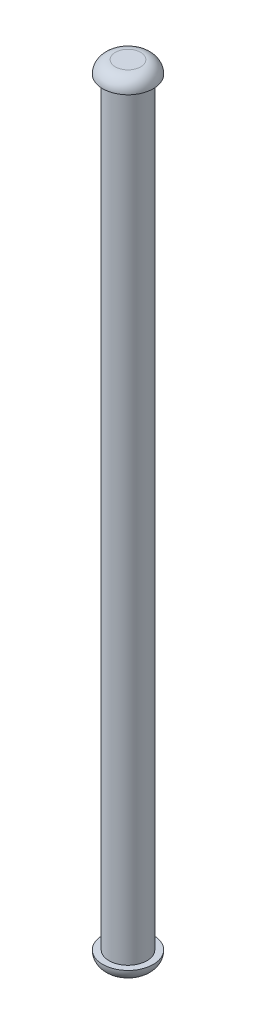
ISO-10303-21;
HEADER;
FILE_DESCRIPTION(('STEP AP214'),'2;1');
FILE_NAME('part.step','',(''),(''),'','','');
FILE_SCHEMA(('AUTOMOTIVE_DESIGN { 1 0 10303 214 1 1 1 1 }'));
ENDSEC;
DATA;
#1=APPLICATION_CONTEXT('core data for automotive mechanical design processes');
#2=APPLICATION_PROTOCOL_DEFINITION('international standard','automotive_design',2000,#1);
#3=PRODUCT_CONTEXT('',#1,'mechanical');
#4=PRODUCT('Part','Part','',(#3));
#5=PRODUCT_RELATED_PRODUCT_CATEGORY('part','',(#4));
#6=PRODUCT_DEFINITION_FORMATION('','',#4);
#7=PRODUCT_DEFINITION_CONTEXT('part definition',#1,'design');
#8=PRODUCT_DEFINITION('design','',#6,#7);
#9=PRODUCT_DEFINITION_SHAPE('','',#8);
#10=(LENGTH_UNIT() NAMED_UNIT(*) SI_UNIT(.MILLI.,.METRE.));
#11=(NAMED_UNIT(*) PLANE_ANGLE_UNIT() SI_UNIT($,.RADIAN.));
#12=(NAMED_UNIT(*) SI_UNIT($,.STERADIAN.) SOLID_ANGLE_UNIT());
#13=UNCERTAINTY_MEASURE_WITH_UNIT(LENGTH_MEASURE(1.E-05),#10,'distance_accuracy_value','');
#14=(GEOMETRIC_REPRESENTATION_CONTEXT(3) GLOBAL_UNCERTAINTY_ASSIGNED_CONTEXT((#13)) GLOBAL_UNIT_ASSIGNED_CONTEXT((#10,
#11,#12)) REPRESENTATION_CONTEXT('',''));
#15=CARTESIAN_POINT('',(0.,0.,0.));
#16=DIRECTION('',(0.,0.,1.));
#17=DIRECTION('',(1.,0.,0.));
#18=AXIS2_PLACEMENT_3D('',#15,#16,#17);
#19=CARTESIAN_POINT('',(0.,60.,0.));
#20=DIRECTION('',(0.,-1.,0.));
#21=DIRECTION('',(0.,0.,-1.));
#22=AXIS2_PLACEMENT_3D('',#19,#20,#21);
#23=CYLINDRICAL_SURFACE('',#22,1.5);
#24=CARTESIAN_POINT('',(0.,60.,0.));
#25=DIRECTION('',(0.,1.,0.));
#26=DIRECTION('',(0.,0.,1.));
#27=AXIS2_PLACEMENT_3D('',#24,#25,#26);
#28=CIRCLE('',#27,1.5);
#29=CARTESIAN_POINT('',(0.,60.,1.5));
#30=VERTEX_POINT('',#29);
#31=EDGE_CURVE('E42',#30,#30,#28,.T.);
#32=ORIENTED_EDGE('',*,*,#31,.F.);
#33=EDGE_LOOP('',(#32));
#34=FACE_BOUND('',#33,.T.);
#35=CARTESIAN_POINT('',(0.,0.,0.));
#36=DIRECTION('',(0.,1.,0.));
#37=DIRECTION('',(0.,0.,1.));
#38=AXIS2_PLACEMENT_3D('',#35,#36,#37);
#39=CIRCLE('',#38,1.5);
#40=CARTESIAN_POINT('',(0.,0.,1.5));
#41=VERTEX_POINT('',#40);
#42=EDGE_CURVE('E49',#41,#41,#39,.T.);
#43=ORIENTED_EDGE('',*,*,#42,.T.);
#44=EDGE_LOOP('',(#43));
#45=FACE_BOUND('',#44,.T.);
#46=ADVANCED_FACE('F31',(#34,#45),#23,.T.);
#47=CARTESIAN_POINT('',(0.,61.,0.));
#48=DIRECTION('',(0.,1.,0.));
#49=DIRECTION('',(0.,0.,1.));
#50=AXIS2_PLACEMENT_3D('',#47,#48,#49);
#51=PLANE('',#50);
#52=CARTESIAN_POINT('',(0.,61.,0.));
#53=DIRECTION('',(0.,1.,0.));
#54=DIRECTION('',(0.,0.,1.));
#55=AXIS2_PLACEMENT_3D('',#52,#53,#54);
#56=CIRCLE('',#55,1.);
#57=CARTESIAN_POINT('',(0.,61.,1.));
#58=VERTEX_POINT('',#57);
#59=EDGE_CURVE('E38',#58,#58,#56,.T.);
#60=ORIENTED_EDGE('',*,*,#59,.T.);
#61=EDGE_LOOP('',(#60));
#62=FACE_BOUND('',#61,.T.);
#63=ADVANCED_FACE('F74',(#62),#51,.T.);
#64=CARTESIAN_POINT('',(0.,60.,0.));
#65=DIRECTION('',(0.,1.,0.));
#66=DIRECTION('',(0.,0.,1.));
#67=AXIS2_PLACEMENT_3D('',#64,#65,#66);
#68=PLANE('',#67);
#69=ORIENTED_EDGE('',*,*,#31,.T.);
#70=EDGE_LOOP('',(#69));
#71=FACE_BOUND('',#70,.T.);
#72=CARTESIAN_POINT('',(0.,60.,0.));
#73=DIRECTION('',(0.,1.,0.));
#74=DIRECTION('',(0.,0.,1.));
#75=AXIS2_PLACEMENT_3D('',#72,#73,#74);
#76=CIRCLE('',#75,2.);
#77=CARTESIAN_POINT('',(0.,60.,2.));
#78=VERTEX_POINT('',#77);
#79=EDGE_CURVE('E46',#78,#78,#76,.T.);
#80=ORIENTED_EDGE('',*,*,#79,.F.);
#81=EDGE_LOOP('',(#80));
#82=FACE_BOUND('',#81,.T.);
#83=ADVANCED_FACE('F80',(#71,#82),#68,.F.);
#84=CARTESIAN_POINT('',(0.,60.,0.));
#85=DIRECTION('',(0.,1.,0.));
#86=DIRECTION('',(0.,0.,1.));
#87=AXIS2_PLACEMENT_3D('',#84,#85,#86);
#88=DEGENERATE_TOROIDAL_SURFACE('',#87,1.,1.,.T.);
#89=ORIENTED_EDGE('',*,*,#79,.T.);
#90=EDGE_LOOP('',(#89));
#91=FACE_BOUND('',#90,.T.);
#92=ORIENTED_EDGE('',*,*,#59,.F.);
#93=EDGE_LOOP('',(#92));
#94=FACE_BOUND('',#93,.T.);
#95=ADVANCED_FACE('F69',(#91,#94),#88,.T.);
#96=CARTESIAN_POINT('',(0.,-1.,0.));
#97=DIRECTION('',(0.,-1.,0.));
#98=DIRECTION('',(0.,0.,-1.));
#99=AXIS2_PLACEMENT_3D('',#96,#97,#98);
#100=PLANE('',#99);
#101=CARTESIAN_POINT('',(0.,-1.,0.));
#102=DIRECTION('',(0.,-1.,0.));
#103=DIRECTION('',(0.,0.,-1.));
#104=AXIS2_PLACEMENT_3D('',#101,#102,#103);
#105=CIRCLE('',#104,1.);
#106=CARTESIAN_POINT('',(0.,-1.,-1.));
#107=VERTEX_POINT('',#106);
#108=EDGE_CURVE('E10',#107,#107,#105,.T.);
#109=ORIENTED_EDGE('',*,*,#108,.T.);
#110=EDGE_LOOP('',(#109));
#111=FACE_BOUND('',#110,.T.);
#112=ADVANCED_FACE('F62',(#111),#100,.T.);
#113=CARTESIAN_POINT('',(0.,0.,0.));
#114=DIRECTION('',(0.,-1.,0.));
#115=DIRECTION('',(0.,0.,-1.));
#116=AXIS2_PLACEMENT_3D('',#113,#114,#115);
#117=PLANE('',#116);
#118=ORIENTED_EDGE('',*,*,#42,.F.);
#119=EDGE_LOOP('',(#118));
#120=FACE_BOUND('',#119,.T.);
#121=CARTESIAN_POINT('',(0.,0.,0.));
#122=DIRECTION('',(0.,-1.,0.));
#123=DIRECTION('',(0.,0.,-1.));
#124=AXIS2_PLACEMENT_3D('',#121,#122,#123);
#125=CIRCLE('',#124,2.);
#126=CARTESIAN_POINT('',(0.,0.,-2.));
#127=VERTEX_POINT('',#126);
#128=EDGE_CURVE('E51',#127,#127,#125,.T.);
#129=ORIENTED_EDGE('',*,*,#128,.F.);
#130=EDGE_LOOP('',(#129));
#131=FACE_BOUND('',#130,.T.);
#132=ADVANCED_FACE('F60',(#120,#131),#117,.F.);
#133=CARTESIAN_POINT('',(0.,0.,0.));
#134=DIRECTION('',(0.,-1.,0.));
#135=DIRECTION('',(0.,0.,-1.));
#136=AXIS2_PLACEMENT_3D('',#133,#134,#135);
#137=DEGENERATE_TOROIDAL_SURFACE('',#136,1.,1.,.T.);
#138=ORIENTED_EDGE('',*,*,#128,.T.);
#139=EDGE_LOOP('',(#138));
#140=FACE_BOUND('',#139,.T.);
#141=ORIENTED_EDGE('',*,*,#108,.F.);
#142=EDGE_LOOP('',(#141));
#143=FACE_BOUND('',#142,.T.);
#144=ADVANCED_FACE('F33',(#140,#143),#137,.T.);
#145=CLOSED_SHELL('',(#46,#63,#83,#95,#112,#132,#144));
#146=MANIFOLD_SOLID_BREP('B2',#145);
#147=ADVANCED_BREP_SHAPE_REPRESENTATION('',(#18,#146),#14);
#148=SHAPE_DEFINITION_REPRESENTATION(#9,#147);
ENDSEC;
END-ISO-10303-21;
